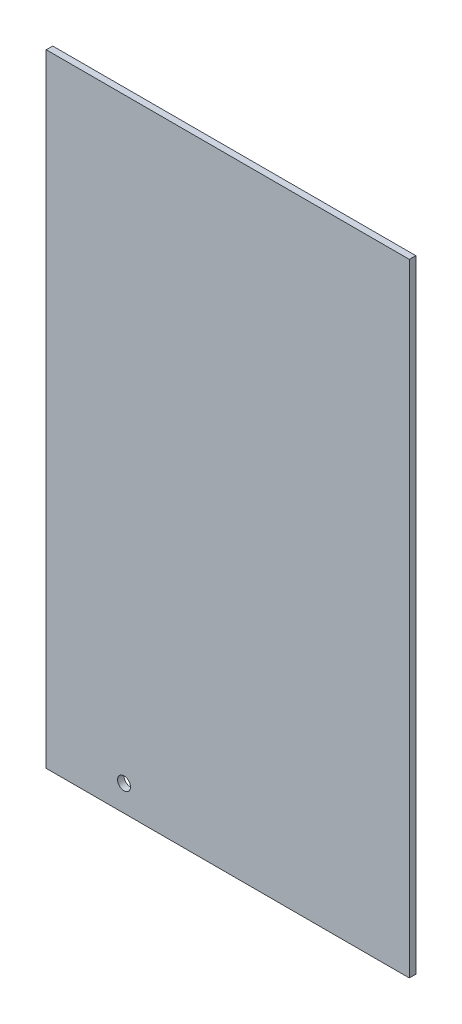
ISO-10303-21;
HEADER;
FILE_DESCRIPTION(('STEP AP214'),'2;1');
FILE_NAME('part.step','',(''),(''),'','','');
FILE_SCHEMA(('AUTOMOTIVE_DESIGN { 1 0 10303 214 1 1 1 1 }'));
ENDSEC;
DATA;
#1=APPLICATION_CONTEXT('core data for automotive mechanical design processes');
#2=APPLICATION_PROTOCOL_DEFINITION('international standard','automotive_design',2000,#1);
#3=PRODUCT_CONTEXT('',#1,'mechanical');
#4=PRODUCT('Part','Part','',(#3));
#5=PRODUCT_RELATED_PRODUCT_CATEGORY('part','',(#4));
#6=PRODUCT_DEFINITION_FORMATION('','',#4);
#7=PRODUCT_DEFINITION_CONTEXT('part definition',#1,'design');
#8=PRODUCT_DEFINITION('design','',#6,#7);
#9=PRODUCT_DEFINITION_SHAPE('','',#8);
#10=(LENGTH_UNIT() NAMED_UNIT(*) SI_UNIT(.MILLI.,.METRE.));
#11=(NAMED_UNIT(*) PLANE_ANGLE_UNIT() SI_UNIT($,.RADIAN.));
#12=(NAMED_UNIT(*) SI_UNIT($,.STERADIAN.) SOLID_ANGLE_UNIT());
#13=UNCERTAINTY_MEASURE_WITH_UNIT(LENGTH_MEASURE(1.E-05),#10,'distance_accuracy_value','');
#14=(GEOMETRIC_REPRESENTATION_CONTEXT(3) GLOBAL_UNCERTAINTY_ASSIGNED_CONTEXT((#13)) GLOBAL_UNIT_ASSIGNED_CONTEXT((#10,
#11,#12)) REPRESENTATION_CONTEXT('',''));
#15=CARTESIAN_POINT('',(0.,0.,0.));
#16=DIRECTION('',(0.,0.,1.));
#17=DIRECTION('',(1.,0.,0.));
#18=AXIS2_PLACEMENT_3D('',#15,#16,#17);
#19=CARTESIAN_POINT('',(0.,0.,3.175));
#20=DIRECTION('',(0.,0.,1.));
#21=DIRECTION('',(1.,0.,0.));
#22=AXIS2_PLACEMENT_3D('',#19,#20,#21);
#23=PLANE('',#22);
#24=DIRECTION('',(0.,-1.,0.));
#25=VECTOR('',#24,1.);
#26=CARTESIAN_POINT('',(0.,304.8,3.175));
#27=LINE('',#26,#25);
#28=CARTESIAN_POINT('',(0.,304.8,3.175));
#29=VERTEX_POINT('',#28);
#30=CARTESIAN_POINT('',(0.,0.,3.175));
#31=VERTEX_POINT('',#30);
#32=EDGE_CURVE('E91',#29,#31,#27,.T.);
#33=ORIENTED_EDGE('',*,*,#32,.T.);
#34=DIRECTION('',(1.,0.,0.));
#35=VECTOR('',#34,1.);
#36=CARTESIAN_POINT('',(0.,0.,3.175));
#37=LINE('',#36,#35);
#38=CARTESIAN_POINT('',(177.8,0.,3.175));
#39=VERTEX_POINT('',#38);
#40=EDGE_CURVE('E86',#31,#39,#37,.T.);
#41=ORIENTED_EDGE('',*,*,#40,.T.);
#42=DIRECTION('',(0.,1.,0.));
#43=VECTOR('',#42,1.);
#44=CARTESIAN_POINT('',(177.8,0.,3.175));
#45=LINE('',#44,#43);
#46=CARTESIAN_POINT('',(177.8,304.8,3.175));
#47=VERTEX_POINT('',#46);
#48=EDGE_CURVE('E89',#39,#47,#45,.T.);
#49=ORIENTED_EDGE('',*,*,#48,.T.);
#50=DIRECTION('',(-1.,0.,0.));
#51=VECTOR('',#50,1.);
#52=CARTESIAN_POINT('',(177.8,304.8,3.175));
#53=LINE('',#52,#51);
#54=EDGE_CURVE('E56',#47,#29,#53,.T.);
#55=ORIENTED_EDGE('',*,*,#54,.T.);
#56=EDGE_LOOP('',(#33,#41,#49,#55));
#57=FACE_BOUND('',#56,.T.);
#58=CARTESIAN_POINT('',(38.1,12.7,3.175));
#59=DIRECTION('',(0.,0.,1.));
#60=DIRECTION('',(1.,0.,0.));
#61=AXIS2_PLACEMENT_3D('',#58,#59,#60);
#62=CIRCLE('',#61,3.175);
#63=CARTESIAN_POINT('',(41.275,12.7,3.175));
#64=VERTEX_POINT('',#63);
#65=EDGE_CURVE('E106',#64,#64,#62,.T.);
#66=ORIENTED_EDGE('',*,*,#65,.F.);
#67=EDGE_LOOP('',(#66));
#68=FACE_BOUND('',#67,.T.);
#69=ADVANCED_FACE('F39',(#57,#68),#23,.T.);
#70=CARTESIAN_POINT('',(0.,0.,0.));
#71=DIRECTION('',(0.,0.,1.));
#72=DIRECTION('',(1.,0.,0.));
#73=AXIS2_PLACEMENT_3D('',#70,#71,#72);
#74=PLANE('',#73);
#75=DIRECTION('',(0.,-1.,0.));
#76=VECTOR('',#75,1.);
#77=CARTESIAN_POINT('',(0.,304.8,0.));
#78=LINE('',#77,#76);
#79=CARTESIAN_POINT('',(0.,304.8,0.));
#80=VERTEX_POINT('',#79);
#81=CARTESIAN_POINT('',(0.,0.,0.));
#82=VERTEX_POINT('',#81);
#83=EDGE_CURVE('E103',#80,#82,#78,.T.);
#84=ORIENTED_EDGE('',*,*,#83,.F.);
#85=DIRECTION('',(-1.,0.,0.));
#86=VECTOR('',#85,1.);
#87=CARTESIAN_POINT('',(177.8,304.8,0.));
#88=LINE('',#87,#86);
#89=CARTESIAN_POINT('',(177.8,304.8,0.));
#90=VERTEX_POINT('',#89);
#91=EDGE_CURVE('E79',#90,#80,#88,.T.);
#92=ORIENTED_EDGE('',*,*,#91,.F.);
#93=DIRECTION('',(0.,1.,0.));
#94=VECTOR('',#93,1.);
#95=CARTESIAN_POINT('',(177.8,0.,0.));
#96=LINE('',#95,#94);
#97=CARTESIAN_POINT('',(177.8,0.,0.));
#98=VERTEX_POINT('',#97);
#99=EDGE_CURVE('E73',#98,#90,#96,.T.);
#100=ORIENTED_EDGE('',*,*,#99,.F.);
#101=DIRECTION('',(1.,0.,0.));
#102=VECTOR('',#101,1.);
#103=CARTESIAN_POINT('',(0.,0.,0.));
#104=LINE('',#103,#102);
#105=EDGE_CURVE('E95',#82,#98,#104,.T.);
#106=ORIENTED_EDGE('',*,*,#105,.F.);
#107=EDGE_LOOP('',(#84,#92,#100,#106));
#108=FACE_BOUND('',#107,.T.);
#109=CARTESIAN_POINT('',(38.1,12.7,0.));
#110=DIRECTION('',(0.,0.,1.));
#111=DIRECTION('',(1.,0.,0.));
#112=AXIS2_PLACEMENT_3D('',#109,#110,#111);
#113=CIRCLE('',#112,3.175);
#114=CARTESIAN_POINT('',(41.275,12.7,0.));
#115=VERTEX_POINT('',#114);
#116=EDGE_CURVE('E118',#115,#115,#113,.T.);
#117=ORIENTED_EDGE('',*,*,#116,.T.);
#118=EDGE_LOOP('',(#117));
#119=FACE_BOUND('',#118,.T.);
#120=ADVANCED_FACE('F114',(#108,#119),#74,.F.);
#121=CARTESIAN_POINT('',(0.,304.8,3.175));
#122=DIRECTION('',(1.,0.,0.));
#123=DIRECTION('',(0.,1.,0.));
#124=AXIS2_PLACEMENT_3D('',#121,#122,#123);
#125=PLANE('',#124);
#126=ORIENTED_EDGE('',*,*,#83,.T.);
#127=DIRECTION('',(0.,0.,-1.));
#128=VECTOR('',#127,1.);
#129=CARTESIAN_POINT('',(0.,0.,3.175));
#130=LINE('',#129,#128);
#131=EDGE_CURVE('E11',#31,#82,#130,.T.);
#132=ORIENTED_EDGE('',*,*,#131,.F.);
#133=ORIENTED_EDGE('',*,*,#32,.F.);
#134=DIRECTION('',(0.,0.,-1.));
#135=VECTOR('',#134,1.);
#136=CARTESIAN_POINT('',(0.,304.8,3.175));
#137=LINE('',#136,#135);
#138=EDGE_CURVE('E99',#29,#80,#137,.T.);
#139=ORIENTED_EDGE('',*,*,#138,.T.);
#140=EDGE_LOOP('',(#126,#132,#133,#139));
#141=FACE_BOUND('',#140,.T.);
#142=ADVANCED_FACE('F41',(#141),#125,.F.);
#143=CARTESIAN_POINT('',(0.,0.,3.175));
#144=DIRECTION('',(0.,1.,0.));
#145=DIRECTION('',(0.,0.,1.));
#146=AXIS2_PLACEMENT_3D('',#143,#144,#145);
#147=PLANE('',#146);
#148=ORIENTED_EDGE('',*,*,#105,.T.);
#149=DIRECTION('',(0.,0.,-1.));
#150=VECTOR('',#149,1.);
#151=CARTESIAN_POINT('',(177.8,0.,3.175));
#152=LINE('',#151,#150);
#153=EDGE_CURVE('E48',#39,#98,#152,.T.);
#154=ORIENTED_EDGE('',*,*,#153,.F.);
#155=ORIENTED_EDGE('',*,*,#40,.F.);
#156=ORIENTED_EDGE('',*,*,#131,.T.);
#157=EDGE_LOOP('',(#148,#154,#155,#156));
#158=FACE_BOUND('',#157,.T.);
#159=ADVANCED_FACE('F94',(#158),#147,.F.);
#160=CARTESIAN_POINT('',(177.8,0.,3.175));
#161=DIRECTION('',(-1.,0.,0.));
#162=DIRECTION('',(0.,-1.,0.));
#163=AXIS2_PLACEMENT_3D('',#160,#161,#162);
#164=PLANE('',#163);
#165=ORIENTED_EDGE('',*,*,#99,.T.);
#166=DIRECTION('',(0.,0.,-1.));
#167=VECTOR('',#166,1.);
#168=CARTESIAN_POINT('',(177.8,304.8,3.175));
#169=LINE('',#168,#167);
#170=EDGE_CURVE('E96',#47,#90,#169,.T.);
#171=ORIENTED_EDGE('',*,*,#170,.F.);
#172=ORIENTED_EDGE('',*,*,#48,.F.);
#173=ORIENTED_EDGE('',*,*,#153,.T.);
#174=EDGE_LOOP('',(#165,#171,#172,#173));
#175=FACE_BOUND('',#174,.T.);
#176=ADVANCED_FACE('F97',(#175),#164,.F.);
#177=CARTESIAN_POINT('',(177.8,304.8,3.175));
#178=DIRECTION('',(0.,-1.,0.));
#179=DIRECTION('',(0.,0.,-1.));
#180=AXIS2_PLACEMENT_3D('',#177,#178,#179);
#181=PLANE('',#180);
#182=ORIENTED_EDGE('',*,*,#91,.T.);
#183=ORIENTED_EDGE('',*,*,#138,.F.);
#184=ORIENTED_EDGE('',*,*,#54,.F.);
#185=ORIENTED_EDGE('',*,*,#170,.T.);
#186=EDGE_LOOP('',(#182,#183,#184,#185));
#187=FACE_BOUND('',#186,.T.);
#188=ADVANCED_FACE('F111',(#187),#181,.F.);
#189=CARTESIAN_POINT('',(38.1,12.7,3.175));
#190=DIRECTION('',(0.,0.,-1.));
#191=DIRECTION('',(-1.,0.,0.));
#192=AXIS2_PLACEMENT_3D('',#189,#190,#191);
#193=CYLINDRICAL_SURFACE('',#192,3.175);
#194=ORIENTED_EDGE('',*,*,#65,.T.);
#195=EDGE_LOOP('',(#194));
#196=FACE_BOUND('',#195,.T.);
#197=ORIENTED_EDGE('',*,*,#116,.F.);
#198=EDGE_LOOP('',(#197));
#199=FACE_BOUND('',#198,.T.);
#200=ADVANCED_FACE('F124',(#196,#199),#193,.F.);
#201=CLOSED_SHELL('',(#69,#120,#142,#159,#176,#188,#200));
#202=MANIFOLD_SOLID_BREP('B2',#201);
#203=ADVANCED_BREP_SHAPE_REPRESENTATION('',(#18,#202),#14);
#204=SHAPE_DEFINITION_REPRESENTATION(#9,#203);
ENDSEC;
END-ISO-10303-21;
